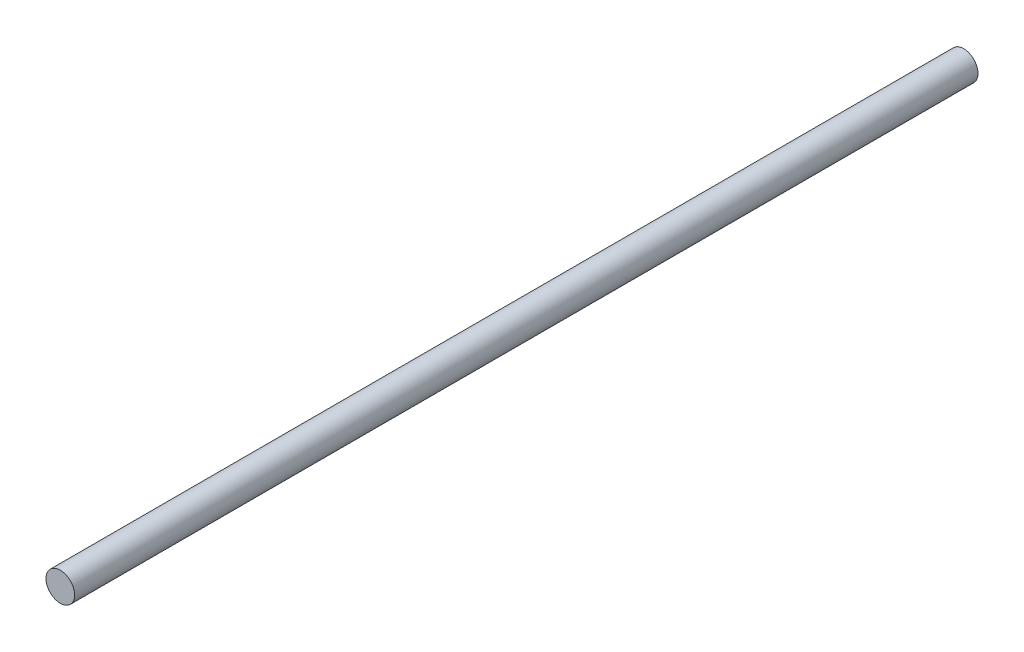
ISO-10303-21;
HEADER;
FILE_DESCRIPTION(('STEP AP214'),'2;1');
FILE_NAME('part.step','',(''),(''),'','','');
FILE_SCHEMA(('AUTOMOTIVE_DESIGN { 1 0 10303 214 1 1 1 1 }'));
ENDSEC;
DATA;
#1=APPLICATION_CONTEXT('core data for automotive mechanical design processes');
#2=APPLICATION_PROTOCOL_DEFINITION('international standard','automotive_design',2000,#1);
#3=PRODUCT_CONTEXT('',#1,'mechanical');
#4=PRODUCT('Part','Part','',(#3));
#5=PRODUCT_RELATED_PRODUCT_CATEGORY('part','',(#4));
#6=PRODUCT_DEFINITION_FORMATION('','',#4);
#7=PRODUCT_DEFINITION_CONTEXT('part definition',#1,'design');
#8=PRODUCT_DEFINITION('design','',#6,#7);
#9=PRODUCT_DEFINITION_SHAPE('','',#8);
#10=(LENGTH_UNIT() NAMED_UNIT(*) SI_UNIT(.MILLI.,.METRE.));
#11=(NAMED_UNIT(*) PLANE_ANGLE_UNIT() SI_UNIT($,.RADIAN.));
#12=(NAMED_UNIT(*) SI_UNIT($,.STERADIAN.) SOLID_ANGLE_UNIT());
#13=UNCERTAINTY_MEASURE_WITH_UNIT(LENGTH_MEASURE(1.E-05),#10,'distance_accuracy_value','');
#14=(GEOMETRIC_REPRESENTATION_CONTEXT(3) GLOBAL_UNCERTAINTY_ASSIGNED_CONTEXT((#13)) GLOBAL_UNIT_ASSIGNED_CONTEXT((#10,
#11,#12)) REPRESENTATION_CONTEXT('',''));
#15=CARTESIAN_POINT('',(0.,0.,0.));
#16=DIRECTION('',(0.,0.,1.));
#17=DIRECTION('',(1.,0.,0.));
#18=AXIS2_PLACEMENT_3D('',#15,#16,#17);
#19=CARTESIAN_POINT('',(0.,0.,315.));
#20=DIRECTION('',(0.,0.,-1.));
#21=DIRECTION('',(-1.,0.,0.));
#22=AXIS2_PLACEMENT_3D('',#19,#20,#21);
#23=CYLINDRICAL_SURFACE('',#22,5.);
#24=CARTESIAN_POINT('',(0.,0.,315.));
#25=DIRECTION('',(0.,0.,1.));
#26=DIRECTION('',(1.,0.,0.));
#27=AXIS2_PLACEMENT_3D('',#24,#25,#26);
#28=CIRCLE('',#27,5.);
#29=CARTESIAN_POINT('',(5.,0.,315.));
#30=VERTEX_POINT('',#29);
#31=EDGE_CURVE('E10',#30,#30,#28,.T.);
#32=ORIENTED_EDGE('',*,*,#31,.F.);
#33=EDGE_LOOP('',(#32));
#34=FACE_BOUND('',#33,.T.);
#35=CARTESIAN_POINT('',(0.,0.,0.));
#36=DIRECTION('',(0.,0.,1.));
#37=DIRECTION('',(1.,0.,0.));
#38=AXIS2_PLACEMENT_3D('',#35,#36,#37);
#39=CIRCLE('',#38,5.);
#40=CARTESIAN_POINT('',(5.,0.,0.));
#41=VERTEX_POINT('',#40);
#42=EDGE_CURVE('E43',#41,#41,#39,.T.);
#43=ORIENTED_EDGE('',*,*,#42,.T.);
#44=EDGE_LOOP('',(#43));
#45=FACE_BOUND('',#44,.T.);
#46=ADVANCED_FACE('F40',(#34,#45),#23,.T.);
#47=CARTESIAN_POINT('',(0.,0.,315.));
#48=DIRECTION('',(0.,0.,1.));
#49=DIRECTION('',(1.,0.,0.));
#50=AXIS2_PLACEMENT_3D('',#47,#48,#49);
#51=PLANE('',#50);
#52=ORIENTED_EDGE('',*,*,#31,.T.);
#53=EDGE_LOOP('',(#52));
#54=FACE_BOUND('',#53,.T.);
#55=ADVANCED_FACE('F55',(#54),#51,.T.);
#56=CARTESIAN_POINT('',(0.,0.,0.));
#57=DIRECTION('',(0.,0.,1.));
#58=DIRECTION('',(1.,0.,0.));
#59=AXIS2_PLACEMENT_3D('',#56,#57,#58);
#60=PLANE('',#59);
#61=ORIENTED_EDGE('',*,*,#42,.F.);
#62=EDGE_LOOP('',(#61));
#63=FACE_BOUND('',#62,.T.);
#64=ADVANCED_FACE('F53',(#63),#60,.F.);
#65=CLOSED_SHELL('',(#46,#55,#64));
#66=MANIFOLD_SOLID_BREP('B2',#65);
#67=ADVANCED_BREP_SHAPE_REPRESENTATION('',(#18,#66),#14);
#68=SHAPE_DEFINITION_REPRESENTATION(#9,#67);
ENDSEC;
END-ISO-10303-21;
